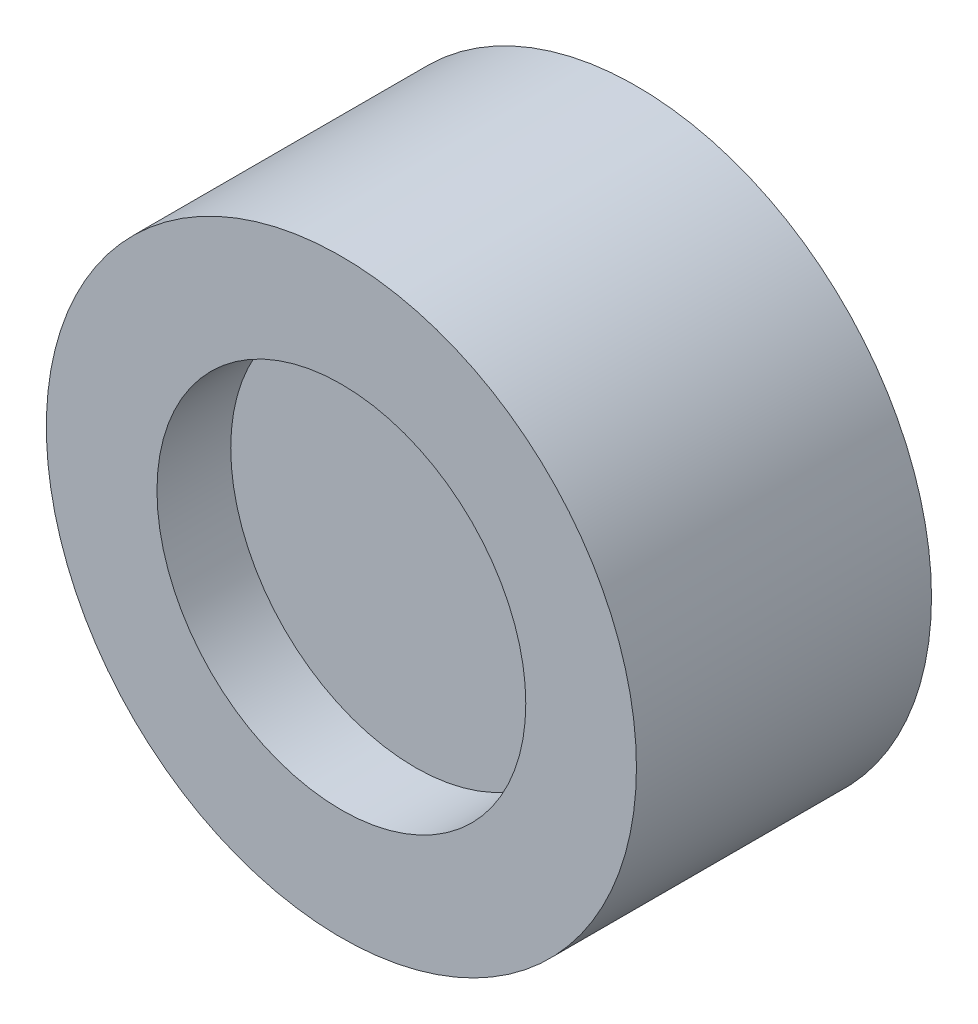
ISO-10303-21;
HEADER;
FILE_DESCRIPTION(('STEP AP214'),'2;1');
FILE_NAME('part.step','',(''),(''),'','','');
FILE_SCHEMA(('AUTOMOTIVE_DESIGN { 1 0 10303 214 1 1 1 1 }'));
ENDSEC;
DATA;
#1=APPLICATION_CONTEXT('core data for automotive mechanical design processes');
#2=APPLICATION_PROTOCOL_DEFINITION('international standard','automotive_design',2000,#1);
#3=PRODUCT_CONTEXT('',#1,'mechanical');
#4=PRODUCT('Part','Part','',(#3));
#5=PRODUCT_RELATED_PRODUCT_CATEGORY('part','',(#4));
#6=PRODUCT_DEFINITION_FORMATION('','',#4);
#7=PRODUCT_DEFINITION_CONTEXT('part definition',#1,'design');
#8=PRODUCT_DEFINITION('design','',#6,#7);
#9=PRODUCT_DEFINITION_SHAPE('','',#8);
#10=(LENGTH_UNIT() NAMED_UNIT(*) SI_UNIT(.MILLI.,.METRE.));
#11=(NAMED_UNIT(*) PLANE_ANGLE_UNIT() SI_UNIT($,.RADIAN.));
#12=(NAMED_UNIT(*) SI_UNIT($,.STERADIAN.) SOLID_ANGLE_UNIT());
#13=UNCERTAINTY_MEASURE_WITH_UNIT(LENGTH_MEASURE(1.E-05),#10,'distance_accuracy_value','');
#14=(GEOMETRIC_REPRESENTATION_CONTEXT(3) GLOBAL_UNCERTAINTY_ASSIGNED_CONTEXT((#13)) GLOBAL_UNIT_ASSIGNED_CONTEXT((#10,
#11,#12)) REPRESENTATION_CONTEXT('',''));
#15=CARTESIAN_POINT('',(0.,0.,0.));
#16=DIRECTION('',(0.,0.,1.));
#17=DIRECTION('',(1.,0.,0.));
#18=AXIS2_PLACEMENT_3D('',#15,#16,#17);
#19=CARTESIAN_POINT('',(0.,0.,10.));
#20=DIRECTION('',(0.,0.,-1.));
#21=DIRECTION('',(-1.,0.,0.));
#22=AXIS2_PLACEMENT_3D('',#19,#20,#21);
#23=CYLINDRICAL_SURFACE('',#22,20.);
#24=CARTESIAN_POINT('',(0.,0.,10.));
#25=DIRECTION('',(0.,0.,1.));
#26=DIRECTION('',(1.,0.,0.));
#27=AXIS2_PLACEMENT_3D('',#24,#25,#26);
#28=CIRCLE('',#27,20.);
#29=CARTESIAN_POINT('',(20.,0.,10.));
#30=VERTEX_POINT('',#29);
#31=EDGE_CURVE('E10',#30,#30,#28,.T.);
#32=ORIENTED_EDGE('',*,*,#31,.F.);
#33=EDGE_LOOP('',(#32));
#34=FACE_BOUND('',#33,.T.);
#35=CARTESIAN_POINT('',(0.,0.,-10.));
#36=DIRECTION('',(0.,0.,1.));
#37=DIRECTION('',(1.,0.,0.));
#38=AXIS2_PLACEMENT_3D('',#35,#36,#37);
#39=CIRCLE('',#38,20.);
#40=CARTESIAN_POINT('',(20.,0.,-10.));
#41=VERTEX_POINT('',#40);
#42=EDGE_CURVE('E36',#41,#41,#39,.T.);
#43=ORIENTED_EDGE('',*,*,#42,.T.);
#44=EDGE_LOOP('',(#43));
#45=FACE_BOUND('',#44,.T.);
#46=ADVANCED_FACE('F33',(#34,#45),#23,.T.);
#47=CARTESIAN_POINT('',(0.,0.,10.));
#48=DIRECTION('',(0.,0.,1.));
#49=DIRECTION('',(1.,0.,0.));
#50=AXIS2_PLACEMENT_3D('',#47,#48,#49);
#51=PLANE('',#50);
#52=CARTESIAN_POINT('',(0.,0.,10.));
#53=DIRECTION('',(0.,0.,1.));
#54=DIRECTION('',(1.,0.,0.));
#55=AXIS2_PLACEMENT_3D('',#52,#53,#54);
#56=CIRCLE('',#55,12.5);
#57=CARTESIAN_POINT('',(12.5,0.,10.));
#58=VERTEX_POINT('',#57);
#59=EDGE_CURVE('E45',#58,#58,#56,.T.);
#60=ORIENTED_EDGE('',*,*,#59,.F.);
#61=EDGE_LOOP('',(#60));
#62=FACE_BOUND('',#61,.T.);
#63=ORIENTED_EDGE('',*,*,#31,.T.);
#64=EDGE_LOOP('',(#63));
#65=FACE_BOUND('',#64,.T.);
#66=ADVANCED_FACE('F60',(#62,#65),#51,.T.);
#67=CARTESIAN_POINT('',(0.,0.,-10.));
#68=DIRECTION('',(0.,0.,1.));
#69=DIRECTION('',(1.,0.,0.));
#70=AXIS2_PLACEMENT_3D('',#67,#68,#69);
#71=PLANE('',#70);
#72=ORIENTED_EDGE('',*,*,#42,.F.);
#73=EDGE_LOOP('',(#72));
#74=FACE_BOUND('',#73,.T.);
#75=ADVANCED_FACE('F56',(#74),#71,.F.);
#76=CARTESIAN_POINT('',(0.,0.,5.));
#77=DIRECTION('',(0.,0.,1.));
#78=DIRECTION('',(1.,0.,0.));
#79=AXIS2_PLACEMENT_3D('',#76,#77,#78);
#80=CYLINDRICAL_SURFACE('',#79,12.5);
#81=CARTESIAN_POINT('',(0.,0.,5.));
#82=DIRECTION('',(0.,0.,1.));
#83=DIRECTION('',(1.,0.,0.));
#84=AXIS2_PLACEMENT_3D('',#81,#82,#83);
#85=CIRCLE('',#84,12.5);
#86=CARTESIAN_POINT('',(12.5,0.,5.));
#87=VERTEX_POINT('',#86);
#88=EDGE_CURVE('E43',#87,#87,#85,.T.);
#89=ORIENTED_EDGE('',*,*,#88,.F.);
#90=EDGE_LOOP('',(#89));
#91=FACE_BOUND('',#90,.T.);
#92=ORIENTED_EDGE('',*,*,#59,.T.);
#93=EDGE_LOOP('',(#92));
#94=FACE_BOUND('',#93,.T.);
#95=ADVANCED_FACE('F53',(#91,#94),#80,.F.);
#96=CARTESIAN_POINT('',(0.,0.,5.));
#97=DIRECTION('',(0.,0.,1.));
#98=DIRECTION('',(1.,0.,0.));
#99=AXIS2_PLACEMENT_3D('',#96,#97,#98);
#100=PLANE('',#99);
#101=ORIENTED_EDGE('',*,*,#88,.T.);
#102=EDGE_LOOP('',(#101));
#103=FACE_BOUND('',#102,.T.);
#104=ADVANCED_FACE('F51',(#103),#100,.T.);
#105=CLOSED_SHELL('',(#46,#66,#75,#95,#104));
#106=MANIFOLD_SOLID_BREP('B2',#105);
#107=ADVANCED_BREP_SHAPE_REPRESENTATION('',(#18,#106),#14);
#108=SHAPE_DEFINITION_REPRESENTATION(#9,#107);
ENDSEC;
END-ISO-10303-21;
